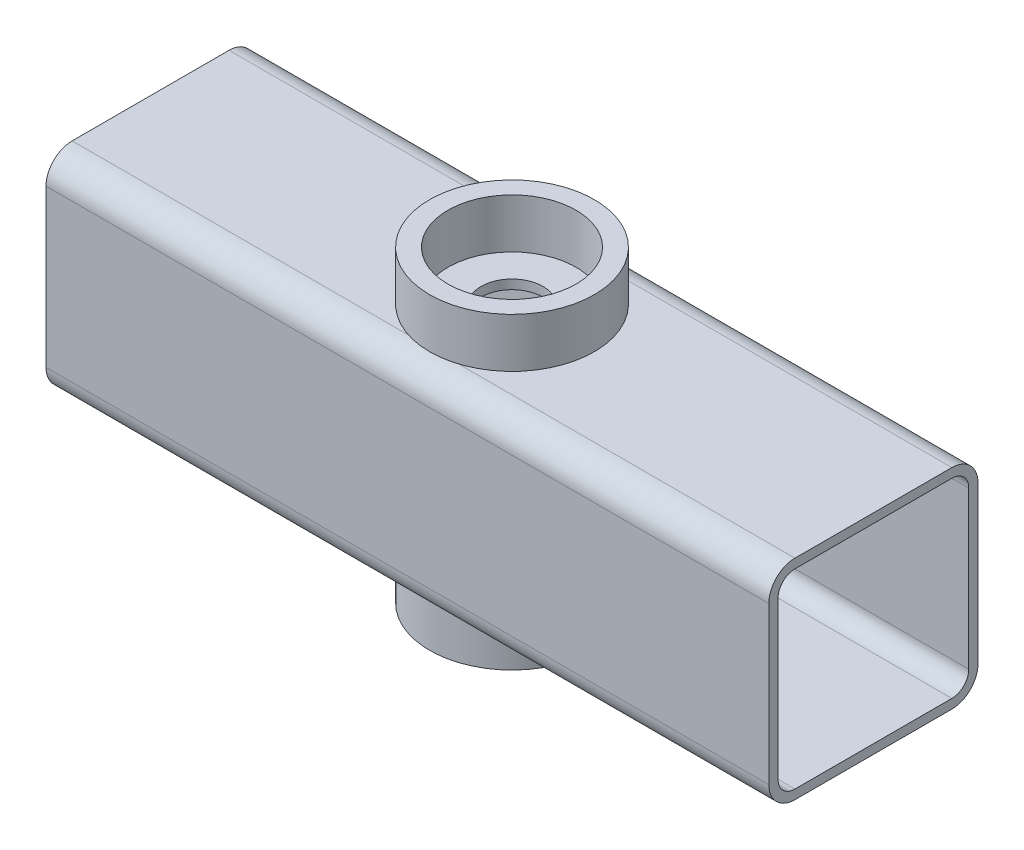
ISO-10303-21;
HEADER;
FILE_DESCRIPTION(('STEP AP214'),'2;1');
FILE_NAME('part.step','',(''),(''),'','','');
FILE_SCHEMA(('AUTOMOTIVE_DESIGN { 1 0 10303 214 1 1 1 1 }'));
ENDSEC;
DATA;
#1=APPLICATION_CONTEXT('core data for automotive mechanical design processes');
#2=APPLICATION_PROTOCOL_DEFINITION('international standard','automotive_design',2000,#1);
#3=PRODUCT_CONTEXT('',#1,'mechanical');
#4=PRODUCT('Part','Part','',(#3));
#5=PRODUCT_RELATED_PRODUCT_CATEGORY('part','',(#4));
#6=PRODUCT_DEFINITION_FORMATION('','',#4);
#7=PRODUCT_DEFINITION_CONTEXT('part definition',#1,'design');
#8=PRODUCT_DEFINITION('design','',#6,#7);
#9=PRODUCT_DEFINITION_SHAPE('','',#8);
#10=(LENGTH_UNIT() NAMED_UNIT(*) SI_UNIT(.MILLI.,.METRE.));
#11=(NAMED_UNIT(*) PLANE_ANGLE_UNIT() SI_UNIT($,.RADIAN.));
#12=(NAMED_UNIT(*) SI_UNIT($,.STERADIAN.) SOLID_ANGLE_UNIT());
#13=UNCERTAINTY_MEASURE_WITH_UNIT(LENGTH_MEASURE(1.E-05),#10,'distance_accuracy_value','');
#14=(GEOMETRIC_REPRESENTATION_CONTEXT(3) GLOBAL_UNCERTAINTY_ASSIGNED_CONTEXT((#13)) GLOBAL_UNIT_ASSIGNED_CONTEXT((#10,
#11,#12)) REPRESENTATION_CONTEXT('',''));
#15=CARTESIAN_POINT('',(0.,0.,0.));
#16=DIRECTION('',(0.,0.,1.));
#17=DIRECTION('',(1.,0.,0.));
#18=AXIS2_PLACEMENT_3D('',#15,#16,#17);
#19=CARTESIAN_POINT('',(-2.80876533438862,-74.8,0.));
#20=DIRECTION('',(0.,1.,0.));
#21=DIRECTION('',(0.,0.,1.));
#22=AXIS2_PLACEMENT_3D('',#19,#20,#21);
#23=CYLINDRICAL_SURFACE('',#22,40.);
#24=CARTESIAN_POINT('',(-2.80876533438862,-74.8,0.));
#25=DIRECTION('',(0.,-1.,0.));
#26=DIRECTION('',(0.,0.,-1.));
#27=AXIS2_PLACEMENT_3D('',#24,#25,#26);
#28=CIRCLE('',#27,40.);
#29=CARTESIAN_POINT('',(-2.80876533438862,-74.8,-40.));
#30=VERTEX_POINT('',#29);
#31=EDGE_CURVE('E12',#30,#30,#28,.T.);
#32=ORIENTED_EDGE('',*,*,#31,.F.);
#33=EDGE_LOOP('',(#32));
#34=FACE_BOUND('',#33,.T.);
#35=CARTESIAN_POINT('',(-2.80876533438862,-50.8,0.));
#36=DIRECTION('',(0.,-1.,0.));
#37=DIRECTION('',(0.,0.,-1.));
#38=AXIS2_PLACEMENT_3D('',#35,#36,#37);
#39=CIRCLE('',#38,40.);
#40=CARTESIAN_POINT('',(-2.80876533438862,-50.8,-40.));
#41=VERTEX_POINT('',#40);
#42=EDGE_CURVE('E78',#41,#41,#39,.T.);
#43=ORIENTED_EDGE('',*,*,#42,.T.);
#44=EDGE_LOOP('',(#43));
#45=FACE_BOUND('',#44,.T.);
#46=ADVANCED_FACE('F71',(#34,#45),#23,.T.);
#47=CARTESIAN_POINT('',(-2.80876533438862,-74.8,0.));
#48=DIRECTION('',(0.,-1.,0.));
#49=DIRECTION('',(0.,0.,-1.));
#50=AXIS2_PLACEMENT_3D('',#47,#48,#49);
#51=PLANE('',#50);
#52=CARTESIAN_POINT('',(-2.80876533438862,-74.8,0.));
#53=DIRECTION('',(0.,-1.,0.));
#54=DIRECTION('',(0.,0.,-1.));
#55=AXIS2_PLACEMENT_3D('',#52,#53,#54);
#56=CIRCLE('',#55,31.1);
#57=CARTESIAN_POINT('',(-2.80876533438862,-74.8,-31.1));
#58=VERTEX_POINT('',#57);
#59=EDGE_CURVE('E84',#58,#58,#56,.T.);
#60=ORIENTED_EDGE('',*,*,#59,.F.);
#61=EDGE_LOOP('',(#60));
#62=FACE_BOUND('',#61,.T.);
#63=ORIENTED_EDGE('',*,*,#31,.T.);
#64=EDGE_LOOP('',(#63));
#65=FACE_BOUND('',#64,.T.);
#66=ADVANCED_FACE('F100',(#62,#65),#51,.T.);
#67=CARTESIAN_POINT('',(-2.80876533438862,-50.8,0.));
#68=DIRECTION('',(0.,-1.,0.));
#69=DIRECTION('',(0.,0.,-1.));
#70=AXIS2_PLACEMENT_3D('',#67,#68,#69);
#71=PLANE('',#70);
#72=CARTESIAN_POINT('',(-2.80876533438862,-50.8,0.));
#73=DIRECTION('',(0.,-1.,0.));
#74=DIRECTION('',(0.,0.,-1.));
#75=AXIS2_PLACEMENT_3D('',#72,#73,#74);
#76=CIRCLE('',#75,31.1);
#77=CARTESIAN_POINT('',(-2.80876533438862,-50.8,-31.1));
#78=VERTEX_POINT('',#77);
#79=EDGE_CURVE('E74',#78,#78,#76,.T.);
#80=ORIENTED_EDGE('',*,*,#79,.T.);
#81=EDGE_LOOP('',(#80));
#82=FACE_BOUND('',#81,.T.);
#83=ORIENTED_EDGE('',*,*,#42,.F.);
#84=EDGE_LOOP('',(#83));
#85=FACE_BOUND('',#84,.T.);
#86=ADVANCED_FACE('F91',(#82,#85),#71,.F.);
#87=CARTESIAN_POINT('',(-2.80876533438862,-44.8,0.));
#88=DIRECTION('',(0.,-1.,0.));
#89=DIRECTION('',(0.,0.,-1.));
#90=AXIS2_PLACEMENT_3D('',#87,#88,#89);
#91=CYLINDRICAL_SURFACE('',#90,31.1);
#92=ORIENTED_EDGE('',*,*,#59,.T.);
#93=EDGE_LOOP('',(#92));
#94=FACE_BOUND('',#93,.T.);
#95=ORIENTED_EDGE('',*,*,#79,.F.);
#96=EDGE_LOOP('',(#95));
#97=FACE_BOUND('',#96,.T.);
#98=ADVANCED_FACE('F94',(#94,#97),#91,.F.);
#99=CLOSED_SHELL('',(#46,#66,#86,#98));
#100=MANIFOLD_SOLID_BREP('B2',#99);
#101=CARTESIAN_POINT('',(-2.80876533438862,74.8,0.));
#102=DIRECTION('',(0.,-1.,0.));
#103=DIRECTION('',(0.,0.,-1.));
#104=AXIS2_PLACEMENT_3D('',#101,#102,#103);
#105=CYLINDRICAL_SURFACE('',#104,40.);
#106=CARTESIAN_POINT('',(-2.80876533438862,74.8,0.));
#107=DIRECTION('',(0.,1.,0.));
#108=DIRECTION('',(0.,0.,1.));
#109=AXIS2_PLACEMENT_3D('',#106,#107,#108);
#110=CIRCLE('',#109,40.);
#111=CARTESIAN_POINT('',(-2.80876533438862,74.8,40.));
#112=VERTEX_POINT('',#111);
#113=EDGE_CURVE('E70',#112,#112,#110,.T.);
#114=ORIENTED_EDGE('',*,*,#113,.F.);
#115=EDGE_LOOP('',(#114));
#116=FACE_BOUND('',#115,.T.);
#117=CARTESIAN_POINT('',(-2.80876533438862,50.8,0.));
#118=DIRECTION('',(0.,1.,0.));
#119=DIRECTION('',(0.,0.,1.));
#120=AXIS2_PLACEMENT_3D('',#117,#118,#119);
#121=CIRCLE('',#120,40.);
#122=CARTESIAN_POINT('',(-2.80876533438862,50.8,40.));
#123=VERTEX_POINT('',#122);
#124=EDGE_CURVE('E148',#123,#123,#121,.T.);
#125=ORIENTED_EDGE('',*,*,#124,.T.);
#126=EDGE_LOOP('',(#125));
#127=FACE_BOUND('',#126,.T.);
#128=ADVANCED_FACE('F141',(#116,#127),#105,.T.);
#129=CARTESIAN_POINT('',(-2.80876533438862,74.8,0.));
#130=DIRECTION('',(0.,1.,0.));
#131=DIRECTION('',(0.,0.,1.));
#132=AXIS2_PLACEMENT_3D('',#129,#130,#131);
#133=PLANE('',#132);
#134=CARTESIAN_POINT('',(-2.80876533438862,74.8,0.));
#135=DIRECTION('',(0.,1.,0.));
#136=DIRECTION('',(0.,0.,1.));
#137=AXIS2_PLACEMENT_3D('',#134,#135,#136);
#138=CIRCLE('',#137,31.1);
#139=CARTESIAN_POINT('',(-2.80876533438862,74.8,31.1));
#140=VERTEX_POINT('',#139);
#141=EDGE_CURVE('E154',#140,#140,#138,.T.);
#142=ORIENTED_EDGE('',*,*,#141,.F.);
#143=EDGE_LOOP('',(#142));
#144=FACE_BOUND('',#143,.T.);
#145=ORIENTED_EDGE('',*,*,#113,.T.);
#146=EDGE_LOOP('',(#145));
#147=FACE_BOUND('',#146,.T.);
#148=ADVANCED_FACE('F170',(#144,#147),#133,.T.);
#149=CARTESIAN_POINT('',(-2.80876533438862,50.8,0.));
#150=DIRECTION('',(0.,1.,0.));
#151=DIRECTION('',(0.,0.,1.));
#152=AXIS2_PLACEMENT_3D('',#149,#150,#151);
#153=PLANE('',#152);
#154=CARTESIAN_POINT('',(-2.80876533438862,50.8,0.));
#155=DIRECTION('',(0.,1.,0.));
#156=DIRECTION('',(0.,0.,1.));
#157=AXIS2_PLACEMENT_3D('',#154,#155,#156);
#158=CIRCLE('',#157,31.1);
#159=CARTESIAN_POINT('',(-2.80876533438862,50.8,31.1));
#160=VERTEX_POINT('',#159);
#161=EDGE_CURVE('E144',#160,#160,#158,.T.);
#162=ORIENTED_EDGE('',*,*,#161,.T.);
#163=EDGE_LOOP('',(#162));
#164=FACE_BOUND('',#163,.T.);
#165=ORIENTED_EDGE('',*,*,#124,.F.);
#166=EDGE_LOOP('',(#165));
#167=FACE_BOUND('',#166,.T.);
#168=ADVANCED_FACE('F161',(#164,#167),#153,.F.);
#169=CARTESIAN_POINT('',(-2.80876533438862,44.8,0.));
#170=DIRECTION('',(0.,1.,0.));
#171=DIRECTION('',(0.,0.,1.));
#172=AXIS2_PLACEMENT_3D('',#169,#170,#171);
#173=CYLINDRICAL_SURFACE('',#172,31.1);
#174=ORIENTED_EDGE('',*,*,#141,.T.);
#175=EDGE_LOOP('',(#174));
#176=FACE_BOUND('',#175,.T.);
#177=ORIENTED_EDGE('',*,*,#161,.F.);
#178=EDGE_LOOP('',(#177));
#179=FACE_BOUND('',#178,.T.);
#180=ADVANCED_FACE('F164',(#176,#179),#173,.F.);
#181=CLOSED_SHELL('',(#128,#148,#168,#180));
#182=MANIFOLD_SOLID_BREP('B7',#181);
#183=CARTESIAN_POINT('',(172.691234665611,38.1,38.1));
#184=DIRECTION('',(-1.,0.,0.));
#185=DIRECTION('',(0.,0.,1.));
#186=AXIS2_PLACEMENT_3D('',#183,#184,#185);
#187=CYLINDRICAL_SURFACE('',#186,12.7);
#188=CARTESIAN_POINT('',(-178.308765334389,38.1,38.1));
#189=DIRECTION('',(1.,0.,0.));
#190=DIRECTION('',(0.,0.,-1.));
#191=AXIS2_PLACEMENT_3D('',#188,#189,#190);
#192=CIRCLE('',#191,12.7);
#193=CARTESIAN_POINT('',(-178.308765334389,50.8,38.1));
#194=VERTEX_POINT('',#193);
#195=CARTESIAN_POINT('',(-178.308765334389,38.1,50.8));
#196=VERTEX_POINT('',#195);
#197=EDGE_CURVE('E375',#194,#196,#192,.T.);
#198=ORIENTED_EDGE('',*,*,#197,.T.);
#199=DIRECTION('',(-1.,0.,0.));
#200=VECTOR('',#199,1.);
#201=CARTESIAN_POINT('',(172.691234665611,38.1,50.8));
#202=LINE('',#201,#200);
#203=CARTESIAN_POINT('',(172.691234665611,38.1,50.8));
#204=VERTEX_POINT('',#203);
#205=EDGE_CURVE('E139',#204,#196,#202,.T.);
#206=ORIENTED_EDGE('',*,*,#205,.F.);
#207=CARTESIAN_POINT('',(172.691234665611,38.1,38.1));
#208=DIRECTION('',(1.,0.,0.));
#209=DIRECTION('',(0.,0.,-1.));
#210=AXIS2_PLACEMENT_3D('',#207,#208,#209);
#211=CIRCLE('',#210,12.7);
#212=CARTESIAN_POINT('',(172.691234665611,50.8,38.1));
#213=VERTEX_POINT('',#212);
#214=EDGE_CURVE('E453',#213,#204,#211,.T.);
#215=ORIENTED_EDGE('',*,*,#214,.F.);
#216=DIRECTION('',(-1.,0.,0.));
#217=VECTOR('',#216,1.);
#218=CARTESIAN_POINT('',(172.691234665611,50.8,38.1));
#219=LINE('',#218,#217);
#220=EDGE_CURVE('E390',#213,#194,#219,.T.);
#221=ORIENTED_EDGE('',*,*,#220,.T.);
#222=EDGE_LOOP('',(#198,#206,#215,#221));
#223=FACE_BOUND('',#222,.T.);
#224=ADVANCED_FACE('F202',(#223),#187,.T.);
#225=CARTESIAN_POINT('',(172.691234665611,38.1,50.8));
#226=DIRECTION('',(0.,0.,-1.));
#227=DIRECTION('',(-1.,0.,0.));
#228=AXIS2_PLACEMENT_3D('',#225,#226,#227);
#229=PLANE('',#228);
#230=DIRECTION('',(0.,-1.,0.));
#231=VECTOR('',#230,1.);
#232=CARTESIAN_POINT('',(-178.308765334389,38.1,50.8));
#233=LINE('',#232,#231);
#234=CARTESIAN_POINT('',(-178.308765334389,-38.1,50.8));
#235=VERTEX_POINT('',#234);
#236=EDGE_CURVE('E378',#196,#235,#233,.T.);
#237=ORIENTED_EDGE('',*,*,#236,.T.);
#238=DIRECTION('',(-1.,0.,0.));
#239=VECTOR('',#238,1.);
#240=CARTESIAN_POINT('',(172.691234665611,-38.1,50.8));
#241=LINE('',#240,#239);
#242=CARTESIAN_POINT('',(172.691234665611,-38.1,50.8));
#243=VERTEX_POINT('',#242);
#244=EDGE_CURVE('E212',#243,#235,#241,.T.);
#245=ORIENTED_EDGE('',*,*,#244,.F.);
#246=DIRECTION('',(0.,-1.,0.));
#247=VECTOR('',#246,1.);
#248=CARTESIAN_POINT('',(172.691234665611,38.1,50.8));
#249=LINE('',#248,#247);
#250=EDGE_CURVE('E455',#204,#243,#249,.T.);
#251=ORIENTED_EDGE('',*,*,#250,.F.);
#252=ORIENTED_EDGE('',*,*,#205,.T.);
#253=EDGE_LOOP('',(#237,#245,#251,#252));
#254=FACE_BOUND('',#253,.T.);
#255=ADVANCED_FACE('F492',(#254),#229,.F.);
#256=CARTESIAN_POINT('',(172.691234665611,-38.1,38.1));
#257=DIRECTION('',(-1.,0.,0.));
#258=DIRECTION('',(0.,0.,1.));
#259=AXIS2_PLACEMENT_3D('',#256,#257,#258);
#260=CYLINDRICAL_SURFACE('',#259,12.7);
#261=CARTESIAN_POINT('',(-178.308765334389,-38.1,38.1));
#262=DIRECTION('',(1.,0.,0.));
#263=DIRECTION('',(0.,0.,-1.));
#264=AXIS2_PLACEMENT_3D('',#261,#262,#263);
#265=CIRCLE('',#264,12.7);
#266=CARTESIAN_POINT('',(-178.308765334389,-50.8,38.1));
#267=VERTEX_POINT('',#266);
#268=EDGE_CURVE('E380',#235,#267,#265,.T.);
#269=ORIENTED_EDGE('',*,*,#268,.T.);
#270=DIRECTION('',(-1.,0.,0.));
#271=VECTOR('',#270,1.);
#272=CARTESIAN_POINT('',(172.691234665611,-50.8,38.1));
#273=LINE('',#272,#271);
#274=CARTESIAN_POINT('',(172.691234665611,-50.8,38.1));
#275=VERTEX_POINT('',#274);
#276=EDGE_CURVE('E397',#275,#267,#273,.T.);
#277=ORIENTED_EDGE('',*,*,#276,.F.);
#278=CARTESIAN_POINT('',(172.691234665611,-38.1,38.1));
#279=DIRECTION('',(1.,0.,0.));
#280=DIRECTION('',(0.,0.,-1.));
#281=AXIS2_PLACEMENT_3D('',#278,#279,#280);
#282=CIRCLE('',#281,12.7);
#283=EDGE_CURVE('E457',#243,#275,#282,.T.);
#284=ORIENTED_EDGE('',*,*,#283,.F.);
#285=ORIENTED_EDGE('',*,*,#244,.T.);
#286=EDGE_LOOP('',(#269,#277,#284,#285));
#287=FACE_BOUND('',#286,.T.);
#288=ADVANCED_FACE('F497',(#287),#260,.T.);
#289=CARTESIAN_POINT('',(172.691234665611,-50.8,-38.1));
#290=DIRECTION('',(0.,1.,0.));
#291=DIRECTION('',(0.,0.,1.));
#292=AXIS2_PLACEMENT_3D('',#289,#290,#291);
#293=PLANE('',#292);
#294=CARTESIAN_POINT('',(-2.80876533438862,-50.8,0.));
#295=DIRECTION('',(0.,1.,0.));
#296=DIRECTION('',(0.,0.,1.));
#297=AXIS2_PLACEMENT_3D('',#294,#295,#296);
#298=CIRCLE('',#297,15.);
#299=CARTESIAN_POINT('',(-2.80876533438862,-50.8,15.));
#300=VERTEX_POINT('',#299);
#301=EDGE_CURVE('E644',#300,#300,#298,.T.);
#302=ORIENTED_EDGE('',*,*,#301,.T.);
#303=EDGE_LOOP('',(#302));
#304=FACE_BOUND('',#303,.T.);
#305=DIRECTION('',(0.,0.,-1.));
#306=VECTOR('',#305,1.);
#307=CARTESIAN_POINT('',(-178.308765334389,-50.8,-38.1));
#308=LINE('',#307,#306);
#309=CARTESIAN_POINT('',(-178.308765334389,-50.8,-38.1));
#310=VERTEX_POINT('',#309);
#311=EDGE_CURVE('E382',#267,#310,#308,.T.);
#312=ORIENTED_EDGE('',*,*,#311,.T.);
#313=DIRECTION('',(-1.,0.,0.));
#314=VECTOR('',#313,1.);
#315=CARTESIAN_POINT('',(172.691234665611,-50.8,-38.1));
#316=LINE('',#315,#314);
#317=CARTESIAN_POINT('',(172.691234665611,-50.8,-38.1));
#318=VERTEX_POINT('',#317);
#319=EDGE_CURVE('E394',#318,#310,#316,.T.);
#320=ORIENTED_EDGE('',*,*,#319,.F.);
#321=DIRECTION('',(0.,0.,-1.));
#322=VECTOR('',#321,1.);
#323=CARTESIAN_POINT('',(172.691234665611,-50.8,-38.1));
#324=LINE('',#323,#322);
#325=EDGE_CURVE('E459',#275,#318,#324,.T.);
#326=ORIENTED_EDGE('',*,*,#325,.F.);
#327=ORIENTED_EDGE('',*,*,#276,.T.);
#328=EDGE_LOOP('',(#312,#320,#326,#327));
#329=FACE_BOUND('',#328,.T.);
#330=ADVANCED_FACE('F465',(#304,#329),#293,.F.);
#331=CARTESIAN_POINT('',(172.691234665611,-38.1,-38.1));
#332=DIRECTION('',(-1.,0.,0.));
#333=DIRECTION('',(0.,0.,1.));
#334=AXIS2_PLACEMENT_3D('',#331,#332,#333);
#335=CYLINDRICAL_SURFACE('',#334,12.7);
#336=CARTESIAN_POINT('',(-178.308765334389,-38.1,-38.1));
#337=DIRECTION('',(1.,0.,0.));
#338=DIRECTION('',(0.,0.,-1.));
#339=AXIS2_PLACEMENT_3D('',#336,#337,#338);
#340=CIRCLE('',#339,12.7);
#341=CARTESIAN_POINT('',(-178.308765334389,-38.1,-50.8));
#342=VERTEX_POINT('',#341);
#343=EDGE_CURVE('E384',#310,#342,#340,.T.);
#344=ORIENTED_EDGE('',*,*,#343,.T.);
#345=DIRECTION('',(-1.,0.,0.));
#346=VECTOR('',#345,1.);
#347=CARTESIAN_POINT('',(172.691234665611,-38.1,-50.8));
#348=LINE('',#347,#346);
#349=CARTESIAN_POINT('',(172.691234665611,-38.1,-50.8));
#350=VERTEX_POINT('',#349);
#351=EDGE_CURVE('E341',#350,#342,#348,.T.);
#352=ORIENTED_EDGE('',*,*,#351,.F.);
#353=CARTESIAN_POINT('',(172.691234665611,-38.1,-38.1));
#354=DIRECTION('',(1.,0.,0.));
#355=DIRECTION('',(0.,0.,-1.));
#356=AXIS2_PLACEMENT_3D('',#353,#354,#355);
#357=CIRCLE('',#356,12.7);
#358=EDGE_CURVE('E332',#318,#350,#357,.T.);
#359=ORIENTED_EDGE('',*,*,#358,.F.);
#360=ORIENTED_EDGE('',*,*,#319,.T.);
#361=EDGE_LOOP('',(#344,#352,#359,#360));
#362=FACE_BOUND('',#361,.T.);
#363=ADVANCED_FACE('F469',(#362),#335,.T.);
#364=CARTESIAN_POINT('',(172.691234665611,-38.1,-50.8));
#365=DIRECTION('',(0.,0.,1.));
#366=DIRECTION('',(1.,0.,0.));
#367=AXIS2_PLACEMENT_3D('',#364,#365,#366);
#368=PLANE('',#367);
#369=DIRECTION('',(0.,1.,0.));
#370=VECTOR('',#369,1.);
#371=CARTESIAN_POINT('',(-178.308765334389,-38.1,-50.8));
#372=LINE('',#371,#370);
#373=CARTESIAN_POINT('',(-178.308765334389,38.1,-50.8));
#374=VERTEX_POINT('',#373);
#375=EDGE_CURVE('E340',#342,#374,#372,.T.);
#376=ORIENTED_EDGE('',*,*,#375,.T.);
#377=DIRECTION('',(-1.,0.,0.));
#378=VECTOR('',#377,1.);
#379=CARTESIAN_POINT('',(172.691234665611,38.1,-50.8));
#380=LINE('',#379,#378);
#381=CARTESIAN_POINT('',(172.691234665611,38.1,-50.8));
#382=VERTEX_POINT('',#381);
#383=EDGE_CURVE('E337',#382,#374,#380,.T.);
#384=ORIENTED_EDGE('',*,*,#383,.F.);
#385=DIRECTION('',(0.,1.,0.));
#386=VECTOR('',#385,1.);
#387=CARTESIAN_POINT('',(172.691234665611,-38.1,-50.8));
#388=LINE('',#387,#386);
#389=EDGE_CURVE('E326',#350,#382,#388,.T.);
#390=ORIENTED_EDGE('',*,*,#389,.F.);
#391=ORIENTED_EDGE('',*,*,#351,.T.);
#392=EDGE_LOOP('',(#376,#384,#390,#391));
#393=FACE_BOUND('',#392,.T.);
#394=ADVANCED_FACE('F338',(#393),#368,.F.);
#395=CARTESIAN_POINT('',(172.691234665611,38.1,-38.1));
#396=DIRECTION('',(-1.,0.,0.));
#397=DIRECTION('',(0.,0.,1.));
#398=AXIS2_PLACEMENT_3D('',#395,#396,#397);
#399=CYLINDRICAL_SURFACE('',#398,12.7);
#400=CARTESIAN_POINT('',(-178.308765334389,38.1,-38.1));
#401=DIRECTION('',(1.,0.,0.));
#402=DIRECTION('',(0.,0.,-1.));
#403=AXIS2_PLACEMENT_3D('',#400,#401,#402);
#404=CIRCLE('',#403,12.7);
#405=CARTESIAN_POINT('',(-178.308765334389,50.8,-38.1));
#406=VERTEX_POINT('',#405);
#407=EDGE_CURVE('E274',#374,#406,#404,.T.);
#408=ORIENTED_EDGE('',*,*,#407,.T.);
#409=DIRECTION('',(-1.,0.,0.));
#410=VECTOR('',#409,1.);
#411=CARTESIAN_POINT('',(172.691234665611,50.8,-38.1));
#412=LINE('',#411,#410);
#413=CARTESIAN_POINT('',(172.691234665611,50.8,-38.1));
#414=VERTEX_POINT('',#413);
#415=EDGE_CURVE('E342',#414,#406,#412,.T.);
#416=ORIENTED_EDGE('',*,*,#415,.F.);
#417=CARTESIAN_POINT('',(172.691234665611,38.1,-38.1));
#418=DIRECTION('',(1.,0.,0.));
#419=DIRECTION('',(0.,0.,-1.));
#420=AXIS2_PLACEMENT_3D('',#417,#418,#419);
#421=CIRCLE('',#420,12.7);
#422=EDGE_CURVE('E330',#382,#414,#421,.T.);
#423=ORIENTED_EDGE('',*,*,#422,.F.);
#424=ORIENTED_EDGE('',*,*,#383,.T.);
#425=EDGE_LOOP('',(#408,#416,#423,#424));
#426=FACE_BOUND('',#425,.T.);
#427=ADVANCED_FACE('F344',(#426),#399,.T.);
#428=CARTESIAN_POINT('',(172.691234665611,-38.1,38.1));
#429=DIRECTION('',(-1.,0.,0.));
#430=DIRECTION('',(0.,0.,1.));
#431=AXIS2_PLACEMENT_3D('',#428,#429,#430);
#432=CYLINDRICAL_SURFACE('',#431,8.20000000000002);
#433=CARTESIAN_POINT('',(-178.308765334389,-38.1,38.1));
#434=DIRECTION('',(1.,0.,0.));
#435=DIRECTION('',(0.,0.,-1.));
#436=AXIS2_PLACEMENT_3D('',#433,#434,#435);
#437=CIRCLE('',#436,8.20000000000002);
#438=CARTESIAN_POINT('',(-178.308765334389,-38.1,46.3));
#439=VERTEX_POINT('',#438);
#440=CARTESIAN_POINT('',(-178.308765334389,-46.3,38.1));
#441=VERTEX_POINT('',#440);
#442=EDGE_CURVE('E350',#439,#441,#437,.T.);
#443=ORIENTED_EDGE('',*,*,#442,.F.);
#444=DIRECTION('',(-1.,0.,0.));
#445=VECTOR('',#444,1.);
#446=CARTESIAN_POINT('',(172.691234665611,-38.1,46.3));
#447=LINE('',#446,#445);
#448=CARTESIAN_POINT('',(172.691234665611,-38.1,46.3));
#449=VERTEX_POINT('',#448);
#450=EDGE_CURVE('E206',#449,#439,#447,.T.);
#451=ORIENTED_EDGE('',*,*,#450,.F.);
#452=CARTESIAN_POINT('',(172.691234665611,-38.1,38.1));
#453=DIRECTION('',(1.,0.,0.));
#454=DIRECTION('',(0.,0.,-1.));
#455=AXIS2_PLACEMENT_3D('',#452,#453,#454);
#456=CIRCLE('',#455,8.20000000000002);
#457=CARTESIAN_POINT('',(172.691234665611,-46.3,38.1));
#458=VERTEX_POINT('',#457);
#459=EDGE_CURVE('E389',#449,#458,#456,.T.);
#460=ORIENTED_EDGE('',*,*,#459,.T.);
#461=DIRECTION('',(-1.,0.,0.));
#462=VECTOR('',#461,1.);
#463=CARTESIAN_POINT('',(172.691234665611,-46.3,38.1));
#464=LINE('',#463,#462);
#465=EDGE_CURVE('E346',#458,#441,#464,.T.);
#466=ORIENTED_EDGE('',*,*,#465,.T.);
#467=EDGE_LOOP('',(#443,#451,#460,#466));
#468=FACE_BOUND('',#467,.T.);
#469=ADVANCED_FACE('F204',(#468),#432,.F.);
#470=CARTESIAN_POINT('',(172.691234665611,38.1,46.3));
#471=DIRECTION('',(0.,0.,-1.));
#472=DIRECTION('',(-1.,0.,0.));
#473=AXIS2_PLACEMENT_3D('',#470,#471,#472);
#474=PLANE('',#473);
#475=DIRECTION('',(0.,-1.,0.));
#476=VECTOR('',#475,1.);
#477=CARTESIAN_POINT('',(-178.308765334389,38.1,46.3));
#478=LINE('',#477,#476);
#479=CARTESIAN_POINT('',(-178.308765334389,38.1,46.3));
#480=VERTEX_POINT('',#479);
#481=EDGE_CURVE('E353',#480,#439,#478,.T.);
#482=ORIENTED_EDGE('',*,*,#481,.F.);
#483=DIRECTION('',(-1.,0.,0.));
#484=VECTOR('',#483,1.);
#485=CARTESIAN_POINT('',(172.691234665611,38.1,46.3));
#486=LINE('',#485,#484);
#487=CARTESIAN_POINT('',(172.691234665611,38.1,46.3));
#488=VERTEX_POINT('',#487);
#489=EDGE_CURVE('E412',#488,#480,#486,.T.);
#490=ORIENTED_EDGE('',*,*,#489,.F.);
#491=DIRECTION('',(0.,-1.,0.));
#492=VECTOR('',#491,1.);
#493=CARTESIAN_POINT('',(172.691234665611,38.1,46.3));
#494=LINE('',#493,#492);
#495=EDGE_CURVE('E421',#488,#449,#494,.T.);
#496=ORIENTED_EDGE('',*,*,#495,.T.);
#497=ORIENTED_EDGE('',*,*,#450,.T.);
#498=EDGE_LOOP('',(#482,#490,#496,#497));
#499=FACE_BOUND('',#498,.T.);
#500=ADVANCED_FACE('F419',(#499),#474,.T.);
#501=CARTESIAN_POINT('',(172.691234665611,38.1,38.1));
#502=DIRECTION('',(-1.,0.,0.));
#503=DIRECTION('',(0.,0.,1.));
#504=AXIS2_PLACEMENT_3D('',#501,#502,#503);
#505=CYLINDRICAL_SURFACE('',#504,8.20000000000001);
#506=CARTESIAN_POINT('',(-178.308765334389,38.1,38.1));
#507=DIRECTION('',(1.,0.,0.));
#508=DIRECTION('',(0.,0.,-1.));
#509=AXIS2_PLACEMENT_3D('',#506,#507,#508);
#510=CIRCLE('',#509,8.20000000000001);
#511=CARTESIAN_POINT('',(-178.308765334389,46.3,38.1));
#512=VERTEX_POINT('',#511);
#513=EDGE_CURVE('E357',#512,#480,#510,.T.);
#514=ORIENTED_EDGE('',*,*,#513,.F.);
#515=DIRECTION('',(-1.,0.,0.));
#516=VECTOR('',#515,1.);
#517=CARTESIAN_POINT('',(172.691234665611,46.3,38.1));
#518=LINE('',#517,#516);
#519=CARTESIAN_POINT('',(172.691234665611,46.3,38.1));
#520=VERTEX_POINT('',#519);
#521=EDGE_CURVE('E411',#520,#512,#518,.T.);
#522=ORIENTED_EDGE('',*,*,#521,.F.);
#523=CARTESIAN_POINT('',(172.691234665611,38.1,38.1));
#524=DIRECTION('',(1.,0.,0.));
#525=DIRECTION('',(0.,0.,-1.));
#526=AXIS2_PLACEMENT_3D('',#523,#524,#525);
#527=CIRCLE('',#526,8.20000000000001);
#528=EDGE_CURVE('E429',#520,#488,#527,.T.);
#529=ORIENTED_EDGE('',*,*,#528,.T.);
#530=ORIENTED_EDGE('',*,*,#489,.T.);
#531=EDGE_LOOP('',(#514,#522,#529,#530));
#532=FACE_BOUND('',#531,.T.);
#533=ADVANCED_FACE('F427',(#532),#505,.F.);
#534=CARTESIAN_POINT('',(172.691234665611,46.3,38.1));
#535=DIRECTION('',(0.,-1.,0.));
#536=DIRECTION('',(0.,0.,-1.));
#537=AXIS2_PLACEMENT_3D('',#534,#535,#536);
#538=PLANE('',#537);
#539=CARTESIAN_POINT('',(-2.80876533438862,46.3,0.));
#540=DIRECTION('',(0.,-1.,0.));
#541=DIRECTION('',(0.,0.,-1.));
#542=AXIS2_PLACEMENT_3D('',#539,#540,#541);
#543=CIRCLE('',#542,15.);
#544=CARTESIAN_POINT('',(-2.80876533438862,46.3,-15.));
#545=VERTEX_POINT('',#544);
#546=EDGE_CURVE('E354',#545,#545,#543,.T.);
#547=ORIENTED_EDGE('',*,*,#546,.F.);
#548=EDGE_LOOP('',(#547));
#549=FACE_BOUND('',#548,.T.);
#550=DIRECTION('',(0.,0.,1.));
#551=VECTOR('',#550,1.);
#552=CARTESIAN_POINT('',(-178.308765334389,46.3,38.1));
#553=LINE('',#552,#551);
#554=CARTESIAN_POINT('',(-178.308765334389,46.3,-38.1));
#555=VERTEX_POINT('',#554);
#556=EDGE_CURVE('E360',#555,#512,#553,.T.);
#557=ORIENTED_EDGE('',*,*,#556,.F.);
#558=DIRECTION('',(-1.,0.,0.));
#559=VECTOR('',#558,1.);
#560=CARTESIAN_POINT('',(172.691234665611,46.3,-38.1));
#561=LINE('',#560,#559);
#562=CARTESIAN_POINT('',(172.691234665611,46.3,-38.1));
#563=VERTEX_POINT('',#562);
#564=EDGE_CURVE('E409',#563,#555,#561,.T.);
#565=ORIENTED_EDGE('',*,*,#564,.F.);
#566=DIRECTION('',(0.,0.,1.));
#567=VECTOR('',#566,1.);
#568=CARTESIAN_POINT('',(172.691234665611,46.3,38.1));
#569=LINE('',#568,#567);
#570=EDGE_CURVE('E435',#563,#520,#569,.T.);
#571=ORIENTED_EDGE('',*,*,#570,.T.);
#572=ORIENTED_EDGE('',*,*,#521,.T.);
#573=EDGE_LOOP('',(#557,#565,#571,#572));
#574=FACE_BOUND('',#573,.T.);
#575=ADVANCED_FACE('F438',(#549,#574),#538,.T.);
#576=CARTESIAN_POINT('',(172.691234665611,38.1,-38.1));
#577=DIRECTION('',(-1.,0.,0.));
#578=DIRECTION('',(0.,0.,1.));
#579=AXIS2_PLACEMENT_3D('',#576,#577,#578);
#580=CYLINDRICAL_SURFACE('',#579,8.20000000000001);
#581=CARTESIAN_POINT('',(-178.308765334389,38.1,-38.1));
#582=DIRECTION('',(1.,0.,0.));
#583=DIRECTION('',(0.,0.,-1.));
#584=AXIS2_PLACEMENT_3D('',#581,#582,#583);
#585=CIRCLE('',#584,8.20000000000001);
#586=CARTESIAN_POINT('',(-178.308765334389,38.1,-46.3));
#587=VERTEX_POINT('',#586);
#588=EDGE_CURVE('E363',#587,#555,#585,.T.);
#589=ORIENTED_EDGE('',*,*,#588,.F.);
#590=DIRECTION('',(-1.,0.,0.));
#591=VECTOR('',#590,1.);
#592=CARTESIAN_POINT('',(172.691234665611,38.1,-46.3));
#593=LINE('',#592,#591);
#594=CARTESIAN_POINT('',(172.691234665611,38.1,-46.3));
#595=VERTEX_POINT('',#594);
#596=EDGE_CURVE('E407',#595,#587,#593,.T.);
#597=ORIENTED_EDGE('',*,*,#596,.F.);
#598=CARTESIAN_POINT('',(172.691234665611,38.1,-38.1));
#599=DIRECTION('',(1.,0.,0.));
#600=DIRECTION('',(0.,0.,-1.));
#601=AXIS2_PLACEMENT_3D('',#598,#599,#600);
#602=CIRCLE('',#601,8.20000000000001);
#603=EDGE_CURVE('E439',#595,#563,#602,.T.);
#604=ORIENTED_EDGE('',*,*,#603,.T.);
#605=ORIENTED_EDGE('',*,*,#564,.T.);
#606=EDGE_LOOP('',(#589,#597,#604,#605));
#607=FACE_BOUND('',#606,.T.);
#608=ADVANCED_FACE('F508',(#607),#580,.F.);
#609=CARTESIAN_POINT('',(172.691234665611,-38.1,-46.3));
#610=DIRECTION('',(0.,0.,1.));
#611=DIRECTION('',(1.,0.,0.));
#612=AXIS2_PLACEMENT_3D('',#609,#610,#611);
#613=PLANE('',#612);
#614=DIRECTION('',(0.,1.,0.));
#615=VECTOR('',#614,1.);
#616=CARTESIAN_POINT('',(-178.308765334389,-38.1,-46.3));
#617=LINE('',#616,#615);
#618=CARTESIAN_POINT('',(-178.308765334389,-38.1,-46.3));
#619=VERTEX_POINT('',#618);
#620=EDGE_CURVE('E366',#619,#587,#617,.T.);
#621=ORIENTED_EDGE('',*,*,#620,.F.);
#622=DIRECTION('',(-1.,0.,0.));
#623=VECTOR('',#622,1.);
#624=CARTESIAN_POINT('',(172.691234665611,-38.1,-46.3));
#625=LINE('',#624,#623);
#626=CARTESIAN_POINT('',(172.691234665611,-38.1,-46.3));
#627=VERTEX_POINT('',#626);
#628=EDGE_CURVE('E405',#627,#619,#625,.T.);
#629=ORIENTED_EDGE('',*,*,#628,.F.);
#630=DIRECTION('',(0.,1.,0.));
#631=VECTOR('',#630,1.);
#632=CARTESIAN_POINT('',(172.691234665611,-38.1,-46.3));
#633=LINE('',#632,#631);
#634=EDGE_CURVE('E441',#627,#595,#633,.T.);
#635=ORIENTED_EDGE('',*,*,#634,.T.);
#636=ORIENTED_EDGE('',*,*,#596,.T.);
#637=EDGE_LOOP('',(#621,#629,#635,#636));
#638=FACE_BOUND('',#637,.T.);
#639=ADVANCED_FACE('F504',(#638),#613,.T.);
#640=CARTESIAN_POINT('',(172.691234665611,-38.1,-38.1));
#641=DIRECTION('',(-1.,0.,0.));
#642=DIRECTION('',(0.,0.,1.));
#643=AXIS2_PLACEMENT_3D('',#640,#641,#642);
#644=CYLINDRICAL_SURFACE('',#643,8.20000000000002);
#645=CARTESIAN_POINT('',(-178.308765334389,-38.1,-38.1));
#646=DIRECTION('',(1.,0.,0.));
#647=DIRECTION('',(0.,0.,-1.));
#648=AXIS2_PLACEMENT_3D('',#645,#646,#647);
#649=CIRCLE('',#648,8.20000000000002);
#650=CARTESIAN_POINT('',(-178.308765334389,-46.3,-38.1));
#651=VERTEX_POINT('',#650);
#652=EDGE_CURVE('E369',#651,#619,#649,.T.);
#653=ORIENTED_EDGE('',*,*,#652,.F.);
#654=DIRECTION('',(-1.,0.,0.));
#655=VECTOR('',#654,1.);
#656=CARTESIAN_POINT('',(172.691234665611,-46.3,-38.1));
#657=LINE('',#656,#655);
#658=CARTESIAN_POINT('',(172.691234665611,-46.3,-38.1));
#659=VERTEX_POINT('',#658);
#660=EDGE_CURVE('E403',#659,#651,#657,.T.);
#661=ORIENTED_EDGE('',*,*,#660,.F.);
#662=CARTESIAN_POINT('',(172.691234665611,-38.1,-38.1));
#663=DIRECTION('',(1.,0.,0.));
#664=DIRECTION('',(0.,0.,-1.));
#665=AXIS2_PLACEMENT_3D('',#662,#663,#664);
#666=CIRCLE('',#665,8.20000000000002);
#667=EDGE_CURVE('E447',#659,#627,#666,.T.);
#668=ORIENTED_EDGE('',*,*,#667,.T.);
#669=ORIENTED_EDGE('',*,*,#628,.T.);
#670=EDGE_LOOP('',(#653,#661,#668,#669));
#671=FACE_BOUND('',#670,.T.);
#672=ADVANCED_FACE('F485',(#671),#644,.F.);
#673=CARTESIAN_POINT('',(172.691234665611,-46.3,-38.1));
#674=DIRECTION('',(0.,1.,0.));
#675=DIRECTION('',(0.,0.,1.));
#676=AXIS2_PLACEMENT_3D('',#673,#674,#675);
#677=PLANE('',#676);
#678=CARTESIAN_POINT('',(-2.80876533438862,-46.3,0.));
#679=DIRECTION('',(0.,1.,0.));
#680=DIRECTION('',(0.,0.,1.));
#681=AXIS2_PLACEMENT_3D('',#678,#679,#680);
#682=CIRCLE('',#681,15.);
#683=CARTESIAN_POINT('',(-2.80876533438862,-46.3,15.));
#684=VERTEX_POINT('',#683);
#685=EDGE_CURVE('E641',#684,#684,#682,.T.);
#686=ORIENTED_EDGE('',*,*,#685,.F.);
#687=EDGE_LOOP('',(#686));
#688=FACE_BOUND('',#687,.T.);
#689=DIRECTION('',(0.,0.,-1.));
#690=VECTOR('',#689,1.);
#691=CARTESIAN_POINT('',(-178.308765334389,-46.3,-38.1));
#692=LINE('',#691,#690);
#693=EDGE_CURVE('E372',#441,#651,#692,.T.);
#694=ORIENTED_EDGE('',*,*,#693,.F.);
#695=ORIENTED_EDGE('',*,*,#465,.F.);
#696=DIRECTION('',(0.,0.,-1.));
#697=VECTOR('',#696,1.);
#698=CARTESIAN_POINT('',(172.691234665611,-46.3,-38.1));
#699=LINE('',#698,#697);
#700=EDGE_CURVE('E450',#458,#659,#699,.T.);
#701=ORIENTED_EDGE('',*,*,#700,.T.);
#702=ORIENTED_EDGE('',*,*,#660,.T.);
#703=EDGE_LOOP('',(#694,#695,#701,#702));
#704=FACE_BOUND('',#703,.T.);
#705=ADVANCED_FACE('F477',(#688,#704),#677,.T.);
#706=CARTESIAN_POINT('',(172.691234665611,50.8,38.1));
#707=DIRECTION('',(0.,-1.,0.));
#708=DIRECTION('',(0.,0.,-1.));
#709=AXIS2_PLACEMENT_3D('',#706,#707,#708);
#710=PLANE('',#709);
#711=CARTESIAN_POINT('',(-2.80876533438862,50.8,0.));
#712=DIRECTION('',(0.,1.,0.));
#713=DIRECTION('',(0.,0.,1.));
#714=AXIS2_PLACEMENT_3D('',#711,#712,#713);
#715=CIRCLE('',#714,15.);
#716=CARTESIAN_POINT('',(-2.80876533438862,50.8,15.));
#717=VERTEX_POINT('',#716);
#718=EDGE_CURVE('E645',#717,#717,#715,.T.);
#719=ORIENTED_EDGE('',*,*,#718,.F.);
#720=EDGE_LOOP('',(#719));
#721=FACE_BOUND('',#720,.T.);
#722=DIRECTION('',(0.,0.,1.));
#723=VECTOR('',#722,1.);
#724=CARTESIAN_POINT('',(-178.308765334389,50.8,38.1));
#725=LINE('',#724,#723);
#726=EDGE_CURVE('E280',#406,#194,#725,.T.);
#727=ORIENTED_EDGE('',*,*,#726,.T.);
#728=ORIENTED_EDGE('',*,*,#220,.F.);
#729=DIRECTION('',(0.,0.,1.));
#730=VECTOR('',#729,1.);
#731=CARTESIAN_POINT('',(172.691234665611,50.8,38.1));
#732=LINE('',#731,#730);
#733=EDGE_CURVE('E221',#414,#213,#732,.T.);
#734=ORIENTED_EDGE('',*,*,#733,.F.);
#735=ORIENTED_EDGE('',*,*,#415,.T.);
#736=EDGE_LOOP('',(#727,#728,#734,#735));
#737=FACE_BOUND('',#736,.T.);
#738=ADVANCED_FACE('F475',(#721,#737),#710,.F.);
#739=CARTESIAN_POINT('',(172.691234665611,38.1,38.1));
#740=DIRECTION('',(1.,0.,0.));
#741=DIRECTION('',(0.,0.,-1.));
#742=AXIS2_PLACEMENT_3D('',#739,#740,#741);
#743=PLANE('',#742);
#744=ORIENTED_EDGE('',*,*,#459,.F.);
#745=ORIENTED_EDGE('',*,*,#495,.F.);
#746=ORIENTED_EDGE('',*,*,#528,.F.);
#747=ORIENTED_EDGE('',*,*,#570,.F.);
#748=ORIENTED_EDGE('',*,*,#603,.F.);
#749=ORIENTED_EDGE('',*,*,#634,.F.);
#750=ORIENTED_EDGE('',*,*,#667,.F.);
#751=ORIENTED_EDGE('',*,*,#700,.F.);
#752=EDGE_LOOP('',(#744,#745,#746,#747,#748,#749,#750,#751));
#753=FACE_BOUND('',#752,.T.);
#754=ORIENTED_EDGE('',*,*,#214,.T.);
#755=ORIENTED_EDGE('',*,*,#250,.T.);
#756=ORIENTED_EDGE('',*,*,#283,.T.);
#757=ORIENTED_EDGE('',*,*,#325,.T.);
#758=ORIENTED_EDGE('',*,*,#358,.T.);
#759=ORIENTED_EDGE('',*,*,#389,.T.);
#760=ORIENTED_EDGE('',*,*,#422,.T.);
#761=ORIENTED_EDGE('',*,*,#733,.T.);
#762=EDGE_LOOP('',(#754,#755,#756,#757,#758,#759,#760,#761));
#763=FACE_BOUND('',#762,.T.);
#764=ADVANCED_FACE('F328',(#753,#763),#743,.T.);
#765=CARTESIAN_POINT('',(-178.308765334389,38.1,38.1));
#766=DIRECTION('',(1.,0.,0.));
#767=DIRECTION('',(0.,0.,-1.));
#768=AXIS2_PLACEMENT_3D('',#765,#766,#767);
#769=PLANE('',#768);
#770=ORIENTED_EDGE('',*,*,#442,.T.);
#771=ORIENTED_EDGE('',*,*,#693,.T.);
#772=ORIENTED_EDGE('',*,*,#652,.T.);
#773=ORIENTED_EDGE('',*,*,#620,.T.);
#774=ORIENTED_EDGE('',*,*,#588,.T.);
#775=ORIENTED_EDGE('',*,*,#556,.T.);
#776=ORIENTED_EDGE('',*,*,#513,.T.);
#777=ORIENTED_EDGE('',*,*,#481,.T.);
#778=EDGE_LOOP('',(#770,#771,#772,#773,#774,#775,#776,#777));
#779=FACE_BOUND('',#778,.T.);
#780=ORIENTED_EDGE('',*,*,#197,.F.);
#781=ORIENTED_EDGE('',*,*,#726,.F.);
#782=ORIENTED_EDGE('',*,*,#407,.F.);
#783=ORIENTED_EDGE('',*,*,#375,.F.);
#784=ORIENTED_EDGE('',*,*,#343,.F.);
#785=ORIENTED_EDGE('',*,*,#311,.F.);
#786=ORIENTED_EDGE('',*,*,#268,.F.);
#787=ORIENTED_EDGE('',*,*,#236,.F.);
#788=EDGE_LOOP('',(#780,#781,#782,#783,#784,#785,#786,#787));
#789=FACE_BOUND('',#788,.T.);
#790=ADVANCED_FACE('F424',(#779,#789),#769,.F.);
#791=CARTESIAN_POINT('',(-2.80876533438862,50.8,0.));
#792=DIRECTION('',(0.,1.,0.));
#793=DIRECTION('',(0.,0.,1.));
#794=AXIS2_PLACEMENT_3D('',#791,#792,#793);
#795=CYLINDRICAL_SURFACE('',#794,15.);
#796=ORIENTED_EDGE('',*,*,#546,.T.);
#797=EDGE_LOOP('',(#796));
#798=FACE_BOUND('',#797,.T.);
#799=ORIENTED_EDGE('',*,*,#718,.T.);
#800=EDGE_LOOP('',(#799));
#801=FACE_BOUND('',#800,.T.);
#802=ADVANCED_FACE('F615',(#798,#801),#795,.F.);
#803=ORIENTED_EDGE('',*,*,#685,.T.);
#804=EDGE_LOOP('',(#803));
#805=FACE_BOUND('',#804,.T.);
#806=ORIENTED_EDGE('',*,*,#301,.F.);
#807=EDGE_LOOP('',(#806));
#808=FACE_BOUND('',#807,.T.);
#809=ADVANCED_FACE('F625',(#805,#808),#795,.F.);
#810=CLOSED_SHELL('',(#224,#255,#288,#330,#363,#394,#427,#469,#500,#533,#575,#608,#639,#672,
#705,#738,#764,#790,#802,#809));
#811=MANIFOLD_SOLID_BREP('B65',#810);
#812=ADVANCED_BREP_SHAPE_REPRESENTATION('',(#18,#100,#182,#811),#14);
#813=SHAPE_DEFINITION_REPRESENTATION(#9,#812);
ENDSEC;
END-ISO-10303-21;
